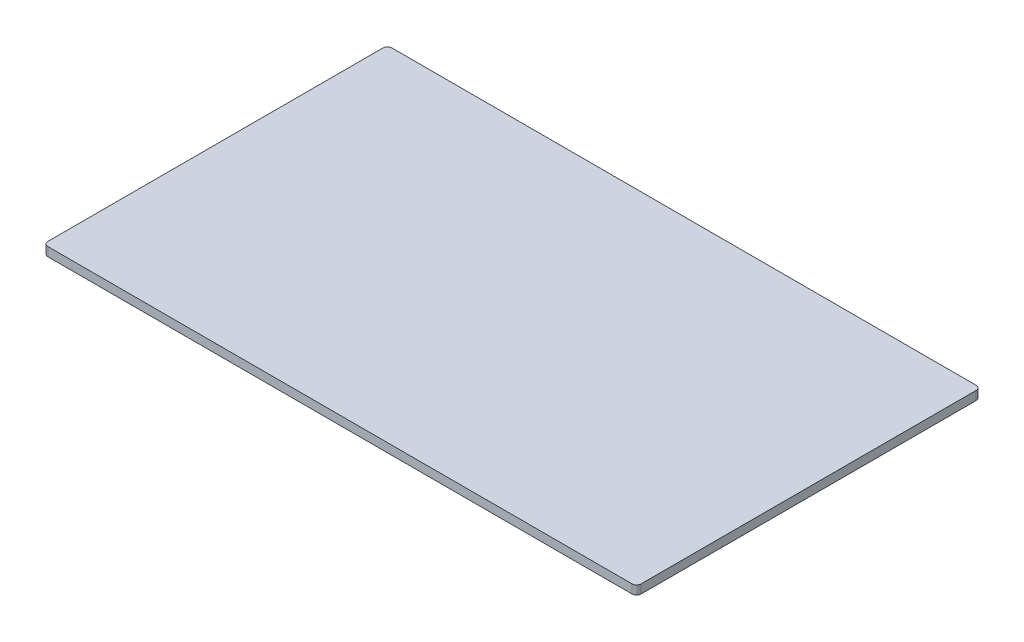
ISO-10303-21;
HEADER;
FILE_DESCRIPTION(('STEP AP214'),'2;1');
FILE_NAME('part.step','',(''),(''),'','','');
FILE_SCHEMA(('AUTOMOTIVE_DESIGN { 1 0 10303 214 1 1 1 1 }'));
ENDSEC;
DATA;
#1=APPLICATION_CONTEXT('core data for automotive mechanical design processes');
#2=APPLICATION_PROTOCOL_DEFINITION('international standard','automotive_design',2000,#1);
#3=PRODUCT_CONTEXT('',#1,'mechanical');
#4=PRODUCT('Part','Part','',(#3));
#5=PRODUCT_RELATED_PRODUCT_CATEGORY('part','',(#4));
#6=PRODUCT_DEFINITION_FORMATION('','',#4);
#7=PRODUCT_DEFINITION_CONTEXT('part definition',#1,'design');
#8=PRODUCT_DEFINITION('design','',#6,#7);
#9=PRODUCT_DEFINITION_SHAPE('','',#8);
#10=(LENGTH_UNIT() NAMED_UNIT(*) SI_UNIT(.MILLI.,.METRE.));
#11=(NAMED_UNIT(*) PLANE_ANGLE_UNIT() SI_UNIT($,.RADIAN.));
#12=(NAMED_UNIT(*) SI_UNIT($,.STERADIAN.) SOLID_ANGLE_UNIT());
#13=UNCERTAINTY_MEASURE_WITH_UNIT(LENGTH_MEASURE(1.E-05),#10,'distance_accuracy_value','');
#14=(GEOMETRIC_REPRESENTATION_CONTEXT(3) GLOBAL_UNCERTAINTY_ASSIGNED_CONTEXT((#13)) GLOBAL_UNIT_ASSIGNED_CONTEXT((#10,
#11,#12)) REPRESENTATION_CONTEXT('',''));
#15=CARTESIAN_POINT('',(0.,0.,0.));
#16=DIRECTION('',(0.,0.,1.));
#17=DIRECTION('',(1.,0.,0.));
#18=AXIS2_PLACEMENT_3D('',#15,#16,#17);
#19=CARTESIAN_POINT('',(0.,1.,0.));
#20=DIRECTION('',(1.,0.,0.));
#21=DIRECTION('',(0.,0.,-1.));
#22=AXIS2_PLACEMENT_3D('',#19,#20,#21);
#23=PLANE('',#22);
#24=DIRECTION('',(0.,0.,1.));
#25=VECTOR('',#24,1.);
#26=CARTESIAN_POINT('',(0.,1.,0.));
#27=LINE('',#26,#25);
#28=CARTESIAN_POINT('',(0.,1.,-38.5));
#29=VERTEX_POINT('',#28);
#30=CARTESIAN_POINT('',(0.,1.,-0.5));
#31=VERTEX_POINT('',#30);
#32=EDGE_CURVE('E131',#29,#31,#27,.T.);
#33=ORIENTED_EDGE('',*,*,#32,.F.);
#34=DIRECTION('',(0.,-1.,0.));
#35=VECTOR('',#34,1.);
#36=CARTESIAN_POINT('',(0.,1.,-38.5));
#37=LINE('',#36,#35);
#38=CARTESIAN_POINT('',(0.,0.,-38.5));
#39=VERTEX_POINT('',#38);
#40=EDGE_CURVE('E115',#29,#39,#37,.T.);
#41=ORIENTED_EDGE('',*,*,#40,.T.);
#42=DIRECTION('',(0.,0.,1.));
#43=VECTOR('',#42,1.);
#44=CARTESIAN_POINT('',(0.,0.,0.));
#45=LINE('',#44,#43);
#46=CARTESIAN_POINT('',(0.,0.,-0.5));
#47=VERTEX_POINT('',#46);
#48=EDGE_CURVE('E128',#39,#47,#45,.T.);
#49=ORIENTED_EDGE('',*,*,#48,.T.);
#50=DIRECTION('',(0.,-1.,0.));
#51=VECTOR('',#50,1.);
#52=CARTESIAN_POINT('',(0.,1.,-0.5));
#53=LINE('',#52,#51);
#54=EDGE_CURVE('E134',#47,#31,#53,.F.);
#55=ORIENTED_EDGE('',*,*,#54,.T.);
#56=EDGE_LOOP('',(#33,#41,#49,#55));
#57=FACE_BOUND('',#56,.T.);
#58=ADVANCED_FACE('F44',(#57),#23,.F.);
#59=CARTESIAN_POINT('',(0.,1.,0.));
#60=DIRECTION('',(0.,0.,-1.));
#61=DIRECTION('',(-1.,0.,0.));
#62=AXIS2_PLACEMENT_3D('',#59,#60,#61);
#63=PLANE('',#62);
#64=DIRECTION('',(1.,0.,0.));
#65=VECTOR('',#64,1.);
#66=CARTESIAN_POINT('',(0.,0.,0.));
#67=LINE('',#66,#65);
#68=CARTESIAN_POINT('',(0.5,0.,0.));
#69=VERTEX_POINT('',#68);
#70=CARTESIAN_POINT('',(66.75,0.,0.));
#71=VERTEX_POINT('',#70);
#72=EDGE_CURVE('E139',#69,#71,#67,.T.);
#73=ORIENTED_EDGE('',*,*,#72,.T.);
#74=DIRECTION('',(0.,-1.,0.));
#75=VECTOR('',#74,1.);
#76=CARTESIAN_POINT('',(66.75,1.,0.));
#77=LINE('',#76,#75);
#78=CARTESIAN_POINT('',(66.75,1.,0.));
#79=VERTEX_POINT('',#78);
#80=EDGE_CURVE('E11',#71,#79,#77,.F.);
#81=ORIENTED_EDGE('',*,*,#80,.T.);
#82=DIRECTION('',(1.,0.,0.));
#83=VECTOR('',#82,1.);
#84=CARTESIAN_POINT('',(0.,1.,0.));
#85=LINE('',#84,#83);
#86=CARTESIAN_POINT('',(0.5,1.,0.));
#87=VERTEX_POINT('',#86);
#88=EDGE_CURVE('E191',#87,#79,#85,.T.);
#89=ORIENTED_EDGE('',*,*,#88,.F.);
#90=DIRECTION('',(0.,-1.,0.));
#91=VECTOR('',#90,1.);
#92=CARTESIAN_POINT('',(0.5,1.,0.));
#93=LINE('',#92,#91);
#94=EDGE_CURVE('E53',#87,#69,#93,.T.);
#95=ORIENTED_EDGE('',*,*,#94,.T.);
#96=EDGE_LOOP('',(#73,#81,#89,#95));
#97=FACE_BOUND('',#96,.T.);
#98=ADVANCED_FACE('F189',(#97),#63,.F.);
#99=CARTESIAN_POINT('',(67.25,1.,0.));
#100=DIRECTION('',(-1.,0.,0.));
#101=DIRECTION('',(0.,0.,1.));
#102=AXIS2_PLACEMENT_3D('',#99,#100,#101);
#103=PLANE('',#102);
#104=DIRECTION('',(0.,0.,-1.));
#105=VECTOR('',#104,1.);
#106=CARTESIAN_POINT('',(67.25,0.,0.));
#107=LINE('',#106,#105);
#108=CARTESIAN_POINT('',(67.25,0.,-0.5));
#109=VERTEX_POINT('',#108);
#110=CARTESIAN_POINT('',(67.25,0.,-38.5));
#111=VERTEX_POINT('',#110);
#112=EDGE_CURVE('E143',#109,#111,#107,.T.);
#113=ORIENTED_EDGE('',*,*,#112,.T.);
#114=DIRECTION('',(0.,-1.,0.));
#115=VECTOR('',#114,1.);
#116=CARTESIAN_POINT('',(67.25,1.,-38.5));
#117=LINE('',#116,#115);
#118=CARTESIAN_POINT('',(67.25,1.,-38.5));
#119=VERTEX_POINT('',#118);
#120=EDGE_CURVE('E60',#111,#119,#117,.F.);
#121=ORIENTED_EDGE('',*,*,#120,.T.);
#122=DIRECTION('',(0.,0.,-1.));
#123=VECTOR('',#122,1.);
#124=CARTESIAN_POINT('',(67.25,1.,0.));
#125=LINE('',#124,#123);
#126=CARTESIAN_POINT('',(67.25,1.,-0.5));
#127=VERTEX_POINT('',#126);
#128=EDGE_CURVE('E199',#127,#119,#125,.T.);
#129=ORIENTED_EDGE('',*,*,#128,.F.);
#130=DIRECTION('',(0.,-1.,0.));
#131=VECTOR('',#130,1.);
#132=CARTESIAN_POINT('',(67.25,1.,-0.5));
#133=LINE('',#132,#131);
#134=EDGE_CURVE('E179',#127,#109,#133,.T.);
#135=ORIENTED_EDGE('',*,*,#134,.T.);
#136=EDGE_LOOP('',(#113,#121,#129,#135));
#137=FACE_BOUND('',#136,.T.);
#138=ADVANCED_FACE('F198',(#137),#103,.F.);
#139=CARTESIAN_POINT('',(0.,1.,-39.));
#140=DIRECTION('',(0.,0.,1.));
#141=DIRECTION('',(1.,0.,0.));
#142=AXIS2_PLACEMENT_3D('',#139,#140,#141);
#143=PLANE('',#142);
#144=DIRECTION('',(-1.,0.,0.));
#145=VECTOR('',#144,1.);
#146=CARTESIAN_POINT('',(0.,0.,-39.));
#147=LINE('',#146,#145);
#148=CARTESIAN_POINT('',(66.75,0.,-39.));
#149=VERTEX_POINT('',#148);
#150=CARTESIAN_POINT('',(0.5,0.,-39.));
#151=VERTEX_POINT('',#150);
#152=EDGE_CURVE('E151',#149,#151,#147,.T.);
#153=ORIENTED_EDGE('',*,*,#152,.T.);
#154=DIRECTION('',(0.,-1.,0.));
#155=VECTOR('',#154,1.);
#156=CARTESIAN_POINT('',(0.5,1.,-39.));
#157=LINE('',#156,#155);
#158=CARTESIAN_POINT('',(0.5,1.,-39.));
#159=VERTEX_POINT('',#158);
#160=EDGE_CURVE('E116',#151,#159,#157,.F.);
#161=ORIENTED_EDGE('',*,*,#160,.T.);
#162=DIRECTION('',(-1.,0.,0.));
#163=VECTOR('',#162,1.);
#164=CARTESIAN_POINT('',(0.,1.,-39.));
#165=LINE('',#164,#163);
#166=CARTESIAN_POINT('',(66.75,1.,-39.));
#167=VERTEX_POINT('',#166);
#168=EDGE_CURVE('E146',#167,#159,#165,.T.);
#169=ORIENTED_EDGE('',*,*,#168,.F.);
#170=DIRECTION('',(0.,-1.,0.));
#171=VECTOR('',#170,1.);
#172=CARTESIAN_POINT('',(66.75,1.,-39.));
#173=LINE('',#172,#171);
#174=EDGE_CURVE('E122',#167,#149,#173,.T.);
#175=ORIENTED_EDGE('',*,*,#174,.T.);
#176=EDGE_LOOP('',(#153,#161,#169,#175));
#177=FACE_BOUND('',#176,.T.);
#178=ADVANCED_FACE('F231',(#177),#143,.F.);
#179=CARTESIAN_POINT('',(0.,1.,0.));
#180=DIRECTION('',(0.,-1.,0.));
#181=DIRECTION('',(0.,0.,-1.));
#182=AXIS2_PLACEMENT_3D('',#179,#180,#181);
#183=PLANE('',#182);
#184=ORIENTED_EDGE('',*,*,#168,.T.);
#185=CARTESIAN_POINT('',(0.5,1.,-38.5));
#186=DIRECTION('',(0.,-1.,0.));
#187=DIRECTION('',(0.,0.,-1.));
#188=AXIS2_PLACEMENT_3D('',#185,#186,#187);
#189=CIRCLE('',#188,0.5);
#190=EDGE_CURVE('E176',#159,#29,#189,.F.);
#191=ORIENTED_EDGE('',*,*,#190,.T.);
#192=ORIENTED_EDGE('',*,*,#32,.T.);
#193=CARTESIAN_POINT('',(0.5,1.,-0.5));
#194=DIRECTION('',(0.,-1.,0.));
#195=DIRECTION('',(0.,0.,-1.));
#196=AXIS2_PLACEMENT_3D('',#193,#194,#195);
#197=CIRCLE('',#196,0.5);
#198=EDGE_CURVE('E168',#31,#87,#197,.F.);
#199=ORIENTED_EDGE('',*,*,#198,.T.);
#200=ORIENTED_EDGE('',*,*,#88,.T.);
#201=CARTESIAN_POINT('',(66.75,1.,-0.5));
#202=DIRECTION('',(0.,-1.,0.));
#203=DIRECTION('',(0.,0.,-1.));
#204=AXIS2_PLACEMENT_3D('',#201,#202,#203);
#205=CIRCLE('',#204,0.5);
#206=EDGE_CURVE('E67',#79,#127,#205,.F.);
#207=ORIENTED_EDGE('',*,*,#206,.T.);
#208=ORIENTED_EDGE('',*,*,#128,.T.);
#209=CARTESIAN_POINT('',(66.75,1.,-38.5));
#210=DIRECTION('',(0.,-1.,0.));
#211=DIRECTION('',(0.,0.,-1.));
#212=AXIS2_PLACEMENT_3D('',#209,#210,#211);
#213=CIRCLE('',#212,0.5);
#214=EDGE_CURVE('E173',#119,#167,#213,.F.);
#215=ORIENTED_EDGE('',*,*,#214,.T.);
#216=EDGE_LOOP('',(#184,#191,#192,#199,#200,#207,#208,#215));
#217=FACE_BOUND('',#216,.T.);
#218=ADVANCED_FACE('F208',(#217),#183,.F.);
#219=CARTESIAN_POINT('',(0.,0.,0.));
#220=DIRECTION('',(0.,-1.,0.));
#221=DIRECTION('',(0.,0.,-1.));
#222=AXIS2_PLACEMENT_3D('',#219,#220,#221);
#223=PLANE('',#222);
#224=ORIENTED_EDGE('',*,*,#48,.F.);
#225=CARTESIAN_POINT('',(0.5,0.,-38.5));
#226=DIRECTION('',(0.,-1.,0.));
#227=DIRECTION('',(0.,0.,-1.));
#228=AXIS2_PLACEMENT_3D('',#225,#226,#227);
#229=CIRCLE('',#228,0.5);
#230=EDGE_CURVE('E111',#39,#151,#229,.T.);
#231=ORIENTED_EDGE('',*,*,#230,.T.);
#232=ORIENTED_EDGE('',*,*,#152,.F.);
#233=CARTESIAN_POINT('',(66.75,0.,-38.5));
#234=DIRECTION('',(0.,-1.,0.));
#235=DIRECTION('',(0.,0.,-1.));
#236=AXIS2_PLACEMENT_3D('',#233,#234,#235);
#237=CIRCLE('',#236,0.5);
#238=EDGE_CURVE('E123',#149,#111,#237,.T.);
#239=ORIENTED_EDGE('',*,*,#238,.T.);
#240=ORIENTED_EDGE('',*,*,#112,.F.);
#241=CARTESIAN_POINT('',(66.75,0.,-0.5));
#242=DIRECTION('',(0.,-1.,0.));
#243=DIRECTION('',(0.,0.,-1.));
#244=AXIS2_PLACEMENT_3D('',#241,#242,#243);
#245=CIRCLE('',#244,0.5);
#246=EDGE_CURVE('E158',#109,#71,#245,.T.);
#247=ORIENTED_EDGE('',*,*,#246,.T.);
#248=ORIENTED_EDGE('',*,*,#72,.F.);
#249=CARTESIAN_POINT('',(0.5,0.,-0.5));
#250=DIRECTION('',(0.,-1.,0.));
#251=DIRECTION('',(0.,0.,-1.));
#252=AXIS2_PLACEMENT_3D('',#249,#250,#251);
#253=CIRCLE('',#252,0.5);
#254=EDGE_CURVE('E133',#69,#47,#253,.T.);
#255=ORIENTED_EDGE('',*,*,#254,.T.);
#256=EDGE_LOOP('',(#224,#231,#232,#239,#240,#247,#248,#255));
#257=FACE_BOUND('',#256,.T.);
#258=ADVANCED_FACE('F136',(#257),#223,.T.);
#259=CARTESIAN_POINT('',(0.5,1.,-38.5));
#260=DIRECTION('',(0.,-1.,0.));
#261=DIRECTION('',(0.,0.,-1.));
#262=AXIS2_PLACEMENT_3D('',#259,#260,#261);
#263=CYLINDRICAL_SURFACE('',#262,0.5);
#264=ORIENTED_EDGE('',*,*,#190,.F.);
#265=ORIENTED_EDGE('',*,*,#160,.F.);
#266=ORIENTED_EDGE('',*,*,#230,.F.);
#267=ORIENTED_EDGE('',*,*,#40,.F.);
#268=EDGE_LOOP('',(#264,#265,#266,#267));
#269=FACE_BOUND('',#268,.T.);
#270=ADVANCED_FACE('F114',(#269),#263,.T.);
#271=CARTESIAN_POINT('',(66.75,1.,-38.5));
#272=DIRECTION('',(0.,-1.,0.));
#273=DIRECTION('',(0.,0.,-1.));
#274=AXIS2_PLACEMENT_3D('',#271,#272,#273);
#275=CYLINDRICAL_SURFACE('',#274,0.5);
#276=ORIENTED_EDGE('',*,*,#214,.F.);
#277=ORIENTED_EDGE('',*,*,#120,.F.);
#278=ORIENTED_EDGE('',*,*,#238,.F.);
#279=ORIENTED_EDGE('',*,*,#174,.F.);
#280=EDGE_LOOP('',(#276,#277,#278,#279));
#281=FACE_BOUND('',#280,.T.);
#282=ADVANCED_FACE('F213',(#281),#275,.T.);
#283=CARTESIAN_POINT('',(66.75,1.,-0.5));
#284=DIRECTION('',(0.,-1.,0.));
#285=DIRECTION('',(0.,0.,-1.));
#286=AXIS2_PLACEMENT_3D('',#283,#284,#285);
#287=CYLINDRICAL_SURFACE('',#286,0.5);
#288=ORIENTED_EDGE('',*,*,#206,.F.);
#289=ORIENTED_EDGE('',*,*,#80,.F.);
#290=ORIENTED_EDGE('',*,*,#246,.F.);
#291=ORIENTED_EDGE('',*,*,#134,.F.);
#292=EDGE_LOOP('',(#288,#289,#290,#291));
#293=FACE_BOUND('',#292,.T.);
#294=ADVANCED_FACE('F197',(#293),#287,.T.);
#295=CARTESIAN_POINT('',(0.5,1.,-0.5));
#296=DIRECTION('',(0.,-1.,0.));
#297=DIRECTION('',(0.,0.,-1.));
#298=AXIS2_PLACEMENT_3D('',#295,#296,#297);
#299=CYLINDRICAL_SURFACE('',#298,0.5);
#300=ORIENTED_EDGE('',*,*,#198,.F.);
#301=ORIENTED_EDGE('',*,*,#54,.F.);
#302=ORIENTED_EDGE('',*,*,#254,.F.);
#303=ORIENTED_EDGE('',*,*,#94,.F.);
#304=EDGE_LOOP('',(#300,#301,#302,#303));
#305=FACE_BOUND('',#304,.T.);
#306=ADVANCED_FACE('F46',(#305),#299,.T.);
#307=CLOSED_SHELL('',(#58,#98,#138,#178,#218,#258,#270,#282,#294,#306));
#308=MANIFOLD_SOLID_BREP('B2',#307);
#309=ADVANCED_BREP_SHAPE_REPRESENTATION('',(#18,#308),#14);
#310=SHAPE_DEFINITION_REPRESENTATION(#9,#309);
ENDSEC;
END-ISO-10303-21;
